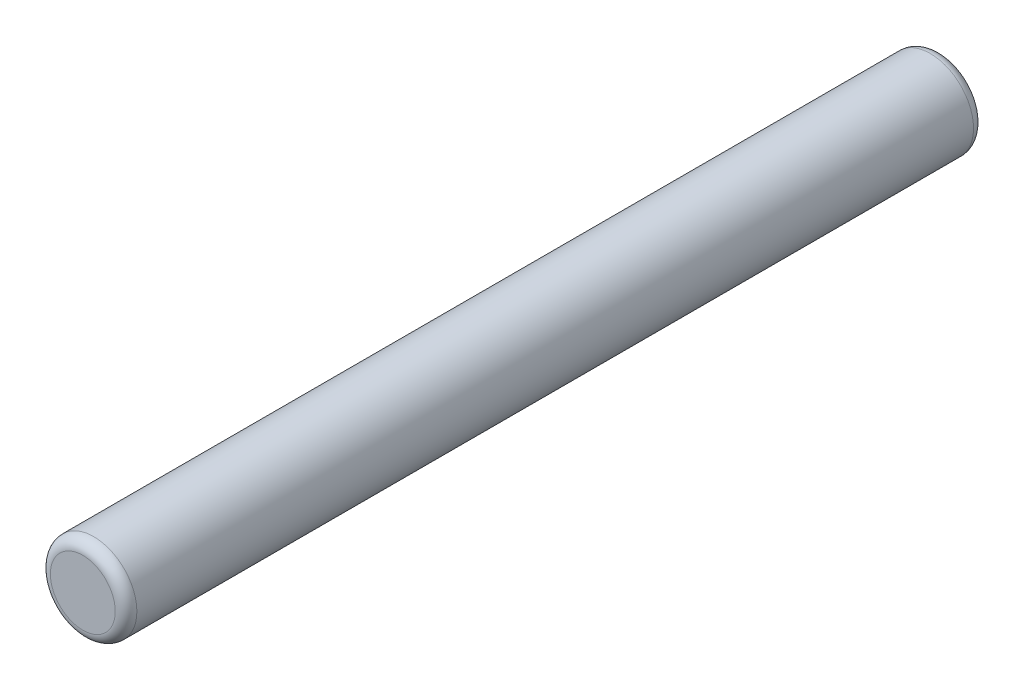
ISO-10303-21;
HEADER;
FILE_DESCRIPTION(('STEP AP214'),'2;1');
FILE_NAME('part.step','',(''),(''),'','','');
FILE_SCHEMA(('AUTOMOTIVE_DESIGN { 1 0 10303 214 1 1 1 1 }'));
ENDSEC;
DATA;
#1=APPLICATION_CONTEXT('core data for automotive mechanical design processes');
#2=APPLICATION_PROTOCOL_DEFINITION('international standard','automotive_design',2000,#1);
#3=PRODUCT_CONTEXT('',#1,'mechanical');
#4=PRODUCT('Part','Part','',(#3));
#5=PRODUCT_RELATED_PRODUCT_CATEGORY('part','',(#4));
#6=PRODUCT_DEFINITION_FORMATION('','',#4);
#7=PRODUCT_DEFINITION_CONTEXT('part definition',#1,'design');
#8=PRODUCT_DEFINITION('design','',#6,#7);
#9=PRODUCT_DEFINITION_SHAPE('','',#8);
#10=(LENGTH_UNIT() NAMED_UNIT(*) SI_UNIT(.MILLI.,.METRE.));
#11=(NAMED_UNIT(*) PLANE_ANGLE_UNIT() SI_UNIT($,.RADIAN.));
#12=(NAMED_UNIT(*) SI_UNIT($,.STERADIAN.) SOLID_ANGLE_UNIT());
#13=UNCERTAINTY_MEASURE_WITH_UNIT(LENGTH_MEASURE(1.E-05),#10,'distance_accuracy_value','');
#14=(GEOMETRIC_REPRESENTATION_CONTEXT(3) GLOBAL_UNCERTAINTY_ASSIGNED_CONTEXT((#13)) GLOBAL_UNIT_ASSIGNED_CONTEXT((#10,
#11,#12)) REPRESENTATION_CONTEXT('',''));
#15=CARTESIAN_POINT('',(0.,0.,0.));
#16=DIRECTION('',(0.,0.,1.));
#17=DIRECTION('',(1.,0.,0.));
#18=AXIS2_PLACEMENT_3D('',#15,#16,#17);
#19=CARTESIAN_POINT('',(0.,0.,19.85));
#20=DIRECTION('',(0.,0.,-1.));
#21=DIRECTION('',(-1.,0.,0.));
#22=AXIS2_PLACEMENT_3D('',#19,#20,#21);
#23=CYLINDRICAL_SURFACE('',#22,2.);
#24=CARTESIAN_POINT('',(0.,0.,-19.35));
#25=DIRECTION('',(0.,0.,1.));
#26=DIRECTION('',(1.,0.,0.));
#27=AXIS2_PLACEMENT_3D('',#24,#25,#26);
#28=CIRCLE('',#27,2.);
#29=CARTESIAN_POINT('',(2.,0.,-19.35));
#30=VERTEX_POINT('',#29);
#31=EDGE_CURVE('E41',#30,#30,#28,.T.);
#32=ORIENTED_EDGE('',*,*,#31,.T.);
#33=EDGE_LOOP('',(#32));
#34=FACE_BOUND('',#33,.T.);
#35=CARTESIAN_POINT('',(0.,0.,19.35));
#36=DIRECTION('',(0.,0.,1.));
#37=DIRECTION('',(1.,0.,0.));
#38=AXIS2_PLACEMENT_3D('',#35,#36,#37);
#39=CIRCLE('',#38,2.);
#40=CARTESIAN_POINT('',(2.,0.,19.35));
#41=VERTEX_POINT('',#40);
#42=EDGE_CURVE('E45',#41,#41,#39,.F.);
#43=ORIENTED_EDGE('',*,*,#42,.T.);
#44=EDGE_LOOP('',(#43));
#45=FACE_BOUND('',#44,.T.);
#46=ADVANCED_FACE('F31',(#34,#45),#23,.T.);
#47=CARTESIAN_POINT('',(0.,0.,19.85));
#48=DIRECTION('',(0.,0.,1.));
#49=DIRECTION('',(1.,0.,0.));
#50=AXIS2_PLACEMENT_3D('',#47,#48,#49);
#51=PLANE('',#50);
#52=CARTESIAN_POINT('',(0.,0.,19.85));
#53=DIRECTION('',(0.,0.,1.));
#54=DIRECTION('',(1.,0.,0.));
#55=AXIS2_PLACEMENT_3D('',#52,#53,#54);
#56=CIRCLE('',#55,1.5);
#57=CARTESIAN_POINT('',(1.5,0.,19.85));
#58=VERTEX_POINT('',#57);
#59=EDGE_CURVE('E10',#58,#58,#56,.T.);
#60=ORIENTED_EDGE('',*,*,#59,.T.);
#61=EDGE_LOOP('',(#60));
#62=FACE_BOUND('',#61,.T.);
#63=ADVANCED_FACE('F64',(#62),#51,.T.);
#64=CARTESIAN_POINT('',(0.,0.,-19.85));
#65=DIRECTION('',(0.,0.,1.));
#66=DIRECTION('',(1.,0.,0.));
#67=AXIS2_PLACEMENT_3D('',#64,#65,#66);
#68=PLANE('',#67);
#69=CARTESIAN_POINT('',(0.,0.,-19.85));
#70=DIRECTION('',(0.,0.,1.));
#71=DIRECTION('',(1.,0.,0.));
#72=AXIS2_PLACEMENT_3D('',#69,#70,#71);
#73=CIRCLE('',#72,1.5);
#74=CARTESIAN_POINT('',(1.5,0.,-19.85));
#75=VERTEX_POINT('',#74);
#76=EDGE_CURVE('E37',#75,#75,#73,.F.);
#77=ORIENTED_EDGE('',*,*,#76,.T.);
#78=EDGE_LOOP('',(#77));
#79=FACE_BOUND('',#78,.T.);
#80=ADVANCED_FACE('F60',(#79),#68,.F.);
#81=CARTESIAN_POINT('',(0.,0.,-19.35));
#82=DIRECTION('',(0.,0.,1.));
#83=DIRECTION('',(1.,0.,0.));
#84=AXIS2_PLACEMENT_3D('',#81,#82,#83);
#85=TOROIDAL_SURFACE('',#84,1.5,0.5);
#86=ORIENTED_EDGE('',*,*,#76,.F.);
#87=EDGE_LOOP('',(#86));
#88=FACE_BOUND('',#87,.T.);
#89=ORIENTED_EDGE('',*,*,#31,.F.);
#90=EDGE_LOOP('',(#89));
#91=FACE_BOUND('',#90,.T.);
#92=ADVANCED_FACE('F55',(#88,#91),#85,.T.);
#93=CARTESIAN_POINT('',(0.,0.,19.35));
#94=DIRECTION('',(0.,0.,1.));
#95=DIRECTION('',(1.,0.,0.));
#96=AXIS2_PLACEMENT_3D('',#93,#94,#95);
#97=TOROIDAL_SURFACE('',#96,1.5,0.5);
#98=ORIENTED_EDGE('',*,*,#42,.F.);
#99=EDGE_LOOP('',(#98));
#100=FACE_BOUND('',#99,.T.);
#101=ORIENTED_EDGE('',*,*,#59,.F.);
#102=EDGE_LOOP('',(#101));
#103=FACE_BOUND('',#102,.T.);
#104=ADVANCED_FACE('F52',(#100,#103),#97,.T.);
#105=CLOSED_SHELL('',(#46,#63,#80,#92,#104));
#106=MANIFOLD_SOLID_BREP('B2',#105);
#107=ADVANCED_BREP_SHAPE_REPRESENTATION('',(#18,#106),#14);
#108=SHAPE_DEFINITION_REPRESENTATION(#9,#107);
ENDSEC;
END-ISO-10303-21;
